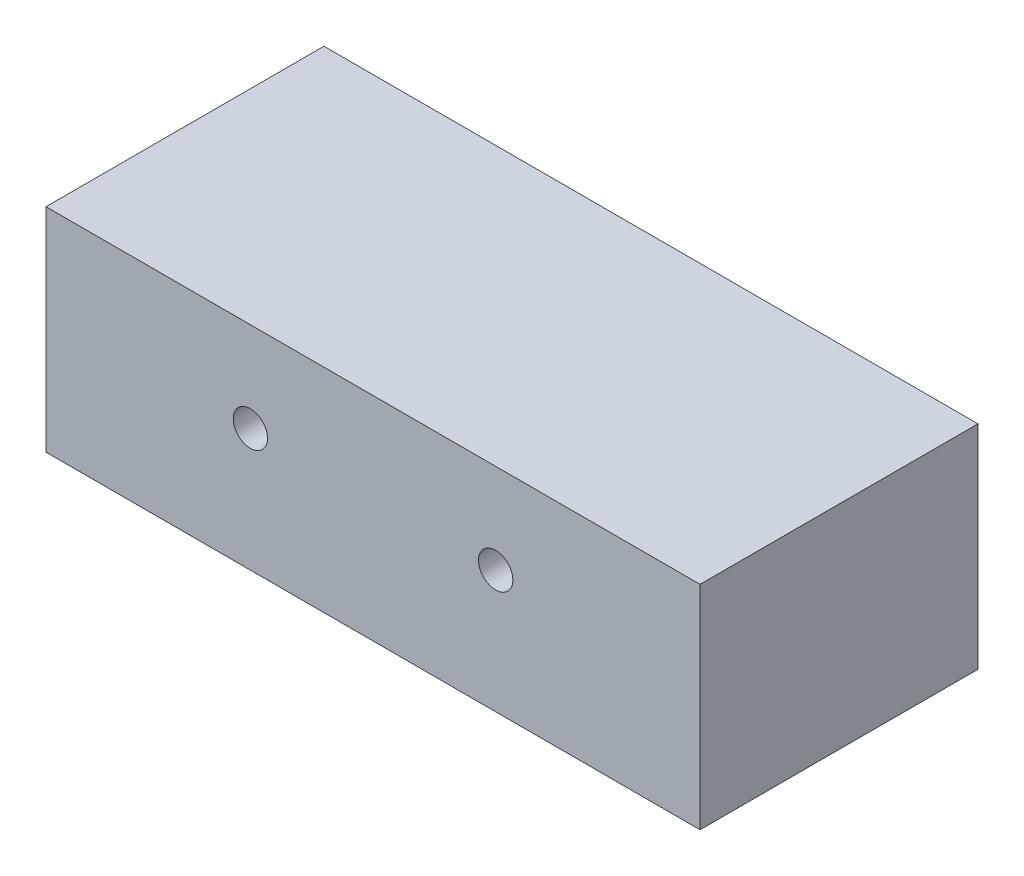
ISO-10303-21;
HEADER;
FILE_DESCRIPTION(('STEP AP214'),'2;1');
FILE_NAME('part.step','',(''),(''),'','','');
FILE_SCHEMA(('AUTOMOTIVE_DESIGN { 1 0 10303 214 1 1 1 1 }'));
ENDSEC;
DATA;
#1=APPLICATION_CONTEXT('core data for automotive mechanical design processes');
#2=APPLICATION_PROTOCOL_DEFINITION('international standard','automotive_design',2000,#1);
#3=PRODUCT_CONTEXT('',#1,'mechanical');
#4=PRODUCT('Part','Part','',(#3));
#5=PRODUCT_RELATED_PRODUCT_CATEGORY('part','',(#4));
#6=PRODUCT_DEFINITION_FORMATION('','',#4);
#7=PRODUCT_DEFINITION_CONTEXT('part definition',#1,'design');
#8=PRODUCT_DEFINITION('design','',#6,#7);
#9=PRODUCT_DEFINITION_SHAPE('','',#8);
#10=(LENGTH_UNIT() NAMED_UNIT(*) SI_UNIT(.MILLI.,.METRE.));
#11=(NAMED_UNIT(*) PLANE_ANGLE_UNIT() SI_UNIT($,.RADIAN.));
#12=(NAMED_UNIT(*) SI_UNIT($,.STERADIAN.) SOLID_ANGLE_UNIT());
#13=UNCERTAINTY_MEASURE_WITH_UNIT(LENGTH_MEASURE(1.E-05),#10,'distance_accuracy_value','');
#14=(GEOMETRIC_REPRESENTATION_CONTEXT(3) GLOBAL_UNCERTAINTY_ASSIGNED_CONTEXT((#13)) GLOBAL_UNIT_ASSIGNED_CONTEXT((#10,
#11,#12)) REPRESENTATION_CONTEXT('',''));
#15=CARTESIAN_POINT('',(0.,0.,0.));
#16=DIRECTION('',(0.,0.,1.));
#17=DIRECTION('',(1.,0.,0.));
#18=AXIS2_PLACEMENT_3D('',#15,#16,#17);
#19=CARTESIAN_POINT('',(0.,0.,34.));
#20=DIRECTION('',(1.,0.,0.));
#21=DIRECTION('',(0.,0.,-1.));
#22=AXIS2_PLACEMENT_3D('',#19,#20,#21);
#23=PLANE('',#22);
#24=DIRECTION('',(0.,-1.,0.));
#25=VECTOR('',#24,1.);
#26=CARTESIAN_POINT('',(0.,0.,0.));
#27=LINE('',#26,#25);
#28=CARTESIAN_POINT('',(0.,26.,0.));
#29=VERTEX_POINT('',#28);
#30=CARTESIAN_POINT('',(0.,0.,0.));
#31=VERTEX_POINT('',#30);
#32=EDGE_CURVE('E128',#29,#31,#27,.T.);
#33=ORIENTED_EDGE('',*,*,#32,.T.);
#34=DIRECTION('',(0.,0.,-1.));
#35=VECTOR('',#34,1.);
#36=CARTESIAN_POINT('',(0.,0.,34.));
#37=LINE('',#36,#35);
#38=CARTESIAN_POINT('',(0.,0.,34.));
#39=VERTEX_POINT('',#38);
#40=EDGE_CURVE('E11',#39,#31,#37,.T.);
#41=ORIENTED_EDGE('',*,*,#40,.F.);
#42=DIRECTION('',(0.,-1.,0.));
#43=VECTOR('',#42,1.);
#44=CARTESIAN_POINT('',(0.,0.,34.));
#45=LINE('',#44,#43);
#46=CARTESIAN_POINT('',(0.,26.,34.));
#47=VERTEX_POINT('',#46);
#48=EDGE_CURVE('E129',#47,#39,#45,.T.);
#49=ORIENTED_EDGE('',*,*,#48,.F.);
#50=DIRECTION('',(0.,0.,-1.));
#51=VECTOR('',#50,1.);
#52=CARTESIAN_POINT('',(0.,26.,34.));
#53=LINE('',#52,#51);
#54=EDGE_CURVE('E135',#47,#29,#53,.T.);
#55=ORIENTED_EDGE('',*,*,#54,.T.);
#56=EDGE_LOOP('',(#33,#41,#49,#55));
#57=FACE_BOUND('',#56,.T.);
#58=ADVANCED_FACE('F35',(#57),#23,.F.);
#59=CARTESIAN_POINT('',(0.,0.,34.));
#60=DIRECTION('',(0.,1.,0.));
#61=DIRECTION('',(0.,0.,1.));
#62=AXIS2_PLACEMENT_3D('',#59,#60,#61);
#63=PLANE('',#62);
#64=DIRECTION('',(1.,0.,0.));
#65=VECTOR('',#64,1.);
#66=CARTESIAN_POINT('',(0.,0.,0.));
#67=LINE('',#66,#65);
#68=CARTESIAN_POINT('',(80.,0.,0.));
#69=VERTEX_POINT('',#68);
#70=EDGE_CURVE('E138',#31,#69,#67,.T.);
#71=ORIENTED_EDGE('',*,*,#70,.T.);
#72=DIRECTION('',(0.,0.,-1.));
#73=VECTOR('',#72,1.);
#74=CARTESIAN_POINT('',(80.,0.,34.));
#75=LINE('',#74,#73);
#76=CARTESIAN_POINT('',(80.,0.,34.));
#77=VERTEX_POINT('',#76);
#78=EDGE_CURVE('E43',#77,#69,#75,.T.);
#79=ORIENTED_EDGE('',*,*,#78,.F.);
#80=DIRECTION('',(1.,0.,0.));
#81=VECTOR('',#80,1.);
#82=CARTESIAN_POINT('',(0.,0.,34.));
#83=LINE('',#82,#81);
#84=EDGE_CURVE('E82',#39,#77,#83,.T.);
#85=ORIENTED_EDGE('',*,*,#84,.F.);
#86=ORIENTED_EDGE('',*,*,#40,.T.);
#87=EDGE_LOOP('',(#71,#79,#85,#86));
#88=FACE_BOUND('',#87,.T.);
#89=ADVANCED_FACE('F162',(#88),#63,.F.);
#90=CARTESIAN_POINT('',(80.,0.,34.));
#91=DIRECTION('',(-1.,0.,0.));
#92=DIRECTION('',(0.,0.,1.));
#93=AXIS2_PLACEMENT_3D('',#90,#91,#92);
#94=PLANE('',#93);
#95=DIRECTION('',(0.,1.,0.));
#96=VECTOR('',#95,1.);
#97=CARTESIAN_POINT('',(80.,0.,0.));
#98=LINE('',#97,#96);
#99=CARTESIAN_POINT('',(80.,26.,0.));
#100=VERTEX_POINT('',#99);
#101=EDGE_CURVE('E69',#69,#100,#98,.T.);
#102=ORIENTED_EDGE('',*,*,#101,.T.);
#103=DIRECTION('',(0.,0.,-1.));
#104=VECTOR('',#103,1.);
#105=CARTESIAN_POINT('',(80.,26.,34.));
#106=LINE('',#105,#104);
#107=CARTESIAN_POINT('',(80.,26.,34.));
#108=VERTEX_POINT('',#107);
#109=EDGE_CURVE('E143',#108,#100,#106,.T.);
#110=ORIENTED_EDGE('',*,*,#109,.F.);
#111=DIRECTION('',(0.,1.,0.));
#112=VECTOR('',#111,1.);
#113=CARTESIAN_POINT('',(80.,0.,34.));
#114=LINE('',#113,#112);
#115=EDGE_CURVE('E132',#77,#108,#114,.T.);
#116=ORIENTED_EDGE('',*,*,#115,.F.);
#117=ORIENTED_EDGE('',*,*,#78,.T.);
#118=EDGE_LOOP('',(#102,#110,#116,#117));
#119=FACE_BOUND('',#118,.T.);
#120=ADVANCED_FACE('F145',(#119),#94,.F.);
#121=CARTESIAN_POINT('',(0.,26.,34.));
#122=DIRECTION('',(0.,-1.,0.));
#123=DIRECTION('',(0.,0.,-1.));
#124=AXIS2_PLACEMENT_3D('',#121,#122,#123);
#125=PLANE('',#124);
#126=DIRECTION('',(-1.,0.,0.));
#127=VECTOR('',#126,1.);
#128=CARTESIAN_POINT('',(0.,26.,0.));
#129=LINE('',#128,#127);
#130=EDGE_CURVE('E75',#100,#29,#129,.T.);
#131=ORIENTED_EDGE('',*,*,#130,.T.);
#132=ORIENTED_EDGE('',*,*,#54,.F.);
#133=DIRECTION('',(-1.,0.,0.));
#134=VECTOR('',#133,1.);
#135=CARTESIAN_POINT('',(0.,26.,34.));
#136=LINE('',#135,#134);
#137=EDGE_CURVE('E51',#108,#47,#136,.T.);
#138=ORIENTED_EDGE('',*,*,#137,.F.);
#139=ORIENTED_EDGE('',*,*,#109,.T.);
#140=EDGE_LOOP('',(#131,#132,#138,#139));
#141=FACE_BOUND('',#140,.T.);
#142=ADVANCED_FACE('F152',(#141),#125,.F.);
#143=CARTESIAN_POINT('',(0.,26.,34.));
#144=DIRECTION('',(0.,0.,-1.));
#145=DIRECTION('',(-1.,0.,0.));
#146=AXIS2_PLACEMENT_3D('',#143,#144,#145);
#147=PLANE('',#146);
#148=CARTESIAN_POINT('',(25.,15.,34.));
#149=DIRECTION('',(0.,0.,1.));
#150=DIRECTION('',(1.,0.,0.));
#151=AXIS2_PLACEMENT_3D('',#148,#149,#150);
#152=CIRCLE('',#151,2.09999999999999);
#153=CARTESIAN_POINT('',(27.1,15.,34.));
#154=VERTEX_POINT('',#153);
#155=EDGE_CURVE('E106',#154,#154,#152,.T.);
#156=ORIENTED_EDGE('',*,*,#155,.F.);
#157=EDGE_LOOP('',(#156));
#158=FACE_BOUND('',#157,.T.);
#159=CARTESIAN_POINT('',(55.,15.,34.));
#160=DIRECTION('',(0.,0.,1.));
#161=DIRECTION('',(1.,0.,0.));
#162=AXIS2_PLACEMENT_3D('',#159,#160,#161);
#163=CIRCLE('',#162,2.09999999999999);
#164=CARTESIAN_POINT('',(57.1,15.,34.));
#165=VERTEX_POINT('',#164);
#166=EDGE_CURVE('E105',#165,#165,#163,.T.);
#167=ORIENTED_EDGE('',*,*,#166,.F.);
#168=EDGE_LOOP('',(#167));
#169=FACE_BOUND('',#168,.T.);
#170=ORIENTED_EDGE('',*,*,#48,.T.);
#171=ORIENTED_EDGE('',*,*,#84,.T.);
#172=ORIENTED_EDGE('',*,*,#115,.T.);
#173=ORIENTED_EDGE('',*,*,#137,.T.);
#174=EDGE_LOOP('',(#170,#171,#172,#173));
#175=FACE_BOUND('',#174,.T.);
#176=ADVANCED_FACE('F154',(#158,#169,#175),#147,.F.);
#177=CARTESIAN_POINT('',(0.,26.,0.));
#178=DIRECTION('',(0.,0.,-1.));
#179=DIRECTION('',(-1.,0.,0.));
#180=AXIS2_PLACEMENT_3D('',#177,#178,#179);
#181=PLANE('',#180);
#182=CARTESIAN_POINT('',(55.,15.,0.));
#183=DIRECTION('',(0.,0.,-1.));
#184=DIRECTION('',(-1.,0.,0.));
#185=AXIS2_PLACEMENT_3D('',#182,#183,#184);
#186=CIRCLE('',#185,2.1);
#187=CARTESIAN_POINT('',(52.9,15.,0.));
#188=VERTEX_POINT('',#187);
#189=EDGE_CURVE('E116',#188,#188,#186,.T.);
#190=ORIENTED_EDGE('',*,*,#189,.F.);
#191=EDGE_LOOP('',(#190));
#192=FACE_BOUND('',#191,.T.);
#193=CARTESIAN_POINT('',(25.,15.,0.));
#194=DIRECTION('',(0.,0.,-1.));
#195=DIRECTION('',(-1.,0.,0.));
#196=AXIS2_PLACEMENT_3D('',#193,#194,#195);
#197=CIRCLE('',#196,2.1);
#198=CARTESIAN_POINT('',(22.9,15.,0.));
#199=VERTEX_POINT('',#198);
#200=EDGE_CURVE('E122',#199,#199,#197,.T.);
#201=ORIENTED_EDGE('',*,*,#200,.F.);
#202=EDGE_LOOP('',(#201));
#203=FACE_BOUND('',#202,.T.);
#204=ORIENTED_EDGE('',*,*,#32,.F.);
#205=ORIENTED_EDGE('',*,*,#130,.F.);
#206=ORIENTED_EDGE('',*,*,#101,.F.);
#207=ORIENTED_EDGE('',*,*,#70,.F.);
#208=EDGE_LOOP('',(#204,#205,#206,#207));
#209=FACE_BOUND('',#208,.T.);
#210=ADVANCED_FACE('F148',(#192,#203,#209),#181,.T.);
#211=CARTESIAN_POINT('',(25.,15.,12.4));
#212=DIRECTION('',(0.,0.,-1.));
#213=DIRECTION('',(-1.,0.,0.));
#214=AXIS2_PLACEMENT_3D('',#211,#212,#213);
#215=CONICAL_SURFACE('',#214,2.1,1.02974425867665);
#216=CARTESIAN_POINT('',(25.,15.,13.6618072999579));
#217=VERTEX_POINT('',#216);
#218=VERTEX_LOOP('',#217);
#219=FACE_BOUND('',#218,.T.);
#220=CARTESIAN_POINT('',(25.,15.,12.4));
#221=DIRECTION('',(0.,0.,-1.));
#222=DIRECTION('',(-1.,0.,0.));
#223=AXIS2_PLACEMENT_3D('',#220,#221,#222);
#224=CIRCLE('',#223,2.1);
#225=CARTESIAN_POINT('',(22.9,15.,12.4));
#226=VERTEX_POINT('',#225);
#227=EDGE_CURVE('E125',#226,#226,#224,.T.);
#228=ORIENTED_EDGE('',*,*,#227,.T.);
#229=EDGE_LOOP('',(#228));
#230=FACE_BOUND('',#229,.T.);
#231=ADVANCED_FACE('F189',(#219,#230),#215,.F.);
#232=CARTESIAN_POINT('',(25.,15.,0.));
#233=DIRECTION('',(0.,0.,-1.));
#234=DIRECTION('',(-1.,0.,0.));
#235=AXIS2_PLACEMENT_3D('',#232,#233,#234);
#236=CYLINDRICAL_SURFACE('',#235,2.1);
#237=ORIENTED_EDGE('',*,*,#227,.F.);
#238=EDGE_LOOP('',(#237));
#239=FACE_BOUND('',#238,.T.);
#240=ORIENTED_EDGE('',*,*,#200,.T.);
#241=EDGE_LOOP('',(#240));
#242=FACE_BOUND('',#241,.T.);
#243=ADVANCED_FACE('F198',(#239,#242),#236,.F.);
#244=CARTESIAN_POINT('',(55.,15.,12.4));
#245=DIRECTION('',(0.,0.,-1.));
#246=DIRECTION('',(-1.,0.,0.));
#247=AXIS2_PLACEMENT_3D('',#244,#245,#246);
#248=CONICAL_SURFACE('',#247,2.1,1.02974425867665);
#249=CARTESIAN_POINT('',(55.,15.,13.6618072999579));
#250=VERTEX_POINT('',#249);
#251=VERTEX_LOOP('',#250);
#252=FACE_BOUND('',#251,.T.);
#253=CARTESIAN_POINT('',(55.,15.,12.4));
#254=DIRECTION('',(0.,0.,-1.));
#255=DIRECTION('',(-1.,0.,0.));
#256=AXIS2_PLACEMENT_3D('',#253,#254,#255);
#257=CIRCLE('',#256,2.1);
#258=CARTESIAN_POINT('',(52.9,15.,12.4));
#259=VERTEX_POINT('',#258);
#260=EDGE_CURVE('E119',#259,#259,#257,.T.);
#261=ORIENTED_EDGE('',*,*,#260,.T.);
#262=EDGE_LOOP('',(#261));
#263=FACE_BOUND('',#262,.T.);
#264=ADVANCED_FACE('F209',(#252,#263),#248,.F.);
#265=CARTESIAN_POINT('',(55.,15.,0.));
#266=DIRECTION('',(0.,0.,-1.));
#267=DIRECTION('',(-1.,0.,0.));
#268=AXIS2_PLACEMENT_3D('',#265,#266,#267);
#269=CYLINDRICAL_SURFACE('',#268,2.1);
#270=ORIENTED_EDGE('',*,*,#260,.F.);
#271=EDGE_LOOP('',(#270));
#272=FACE_BOUND('',#271,.T.);
#273=ORIENTED_EDGE('',*,*,#189,.T.);
#274=EDGE_LOOP('',(#273));
#275=FACE_BOUND('',#274,.T.);
#276=ADVANCED_FACE('F220',(#272,#275),#269,.F.);
#277=CARTESIAN_POINT('',(55.,15.,21.6));
#278=DIRECTION('',(0.,0.,1.));
#279=DIRECTION('',(1.,0.,0.));
#280=AXIS2_PLACEMENT_3D('',#277,#278,#279);
#281=CONICAL_SURFACE('',#280,2.09999999999998,1.02974425867665);
#282=CARTESIAN_POINT('',(55.,15.,20.3381927000421));
#283=VERTEX_POINT('',#282);
#284=VERTEX_LOOP('',#283);
#285=FACE_BOUND('',#284,.T.);
#286=CARTESIAN_POINT('',(55.,15.,21.6));
#287=DIRECTION('',(0.,0.,1.));
#288=DIRECTION('',(1.,0.,0.));
#289=AXIS2_PLACEMENT_3D('',#286,#287,#288);
#290=CIRCLE('',#289,2.09999999999998);
#291=CARTESIAN_POINT('',(57.1,15.,21.6));
#292=VERTEX_POINT('',#291);
#293=EDGE_CURVE('E109',#292,#292,#290,.T.);
#294=ORIENTED_EDGE('',*,*,#293,.T.);
#295=EDGE_LOOP('',(#294));
#296=FACE_BOUND('',#295,.T.);
#297=ADVANCED_FACE('F230',(#285,#296),#281,.F.);
#298=CARTESIAN_POINT('',(55.,15.,34.));
#299=DIRECTION('',(0.,0.,1.));
#300=DIRECTION('',(1.,0.,0.));
#301=AXIS2_PLACEMENT_3D('',#298,#299,#300);
#302=CYLINDRICAL_SURFACE('',#301,2.09999999999999);
#303=ORIENTED_EDGE('',*,*,#293,.F.);
#304=EDGE_LOOP('',(#303));
#305=FACE_BOUND('',#304,.T.);
#306=ORIENTED_EDGE('',*,*,#166,.T.);
#307=EDGE_LOOP('',(#306));
#308=FACE_BOUND('',#307,.T.);
#309=ADVANCED_FACE('F99',(#305,#308),#302,.F.);
#310=CARTESIAN_POINT('',(25.,15.,21.6));
#311=DIRECTION('',(0.,0.,1.));
#312=DIRECTION('',(1.,0.,0.));
#313=AXIS2_PLACEMENT_3D('',#310,#311,#312);
#314=CONICAL_SURFACE('',#313,2.09999999999999,1.02974425867665);
#315=CARTESIAN_POINT('',(25.,15.,20.3381927000421));
#316=VERTEX_POINT('',#315);
#317=VERTEX_LOOP('',#316);
#318=FACE_BOUND('',#317,.T.);
#319=CARTESIAN_POINT('',(25.,15.,21.6));
#320=DIRECTION('',(0.,0.,1.));
#321=DIRECTION('',(1.,0.,0.));
#322=AXIS2_PLACEMENT_3D('',#319,#320,#321);
#323=CIRCLE('',#322,2.09999999999999);
#324=CARTESIAN_POINT('',(27.1,15.,21.6));
#325=VERTEX_POINT('',#324);
#326=EDGE_CURVE('E103',#325,#325,#323,.T.);
#327=ORIENTED_EDGE('',*,*,#326,.T.);
#328=EDGE_LOOP('',(#327));
#329=FACE_BOUND('',#328,.T.);
#330=ADVANCED_FACE('F95',(#318,#329),#314,.F.);
#331=CARTESIAN_POINT('',(25.,15.,34.));
#332=DIRECTION('',(0.,0.,1.));
#333=DIRECTION('',(1.,0.,0.));
#334=AXIS2_PLACEMENT_3D('',#331,#332,#333);
#335=CYLINDRICAL_SURFACE('',#334,2.09999999999999);
#336=ORIENTED_EDGE('',*,*,#326,.F.);
#337=EDGE_LOOP('',(#336));
#338=FACE_BOUND('',#337,.T.);
#339=ORIENTED_EDGE('',*,*,#155,.T.);
#340=EDGE_LOOP('',(#339));
#341=FACE_BOUND('',#340,.T.);
#342=ADVANCED_FACE('F98',(#338,#341),#335,.F.);
#343=CLOSED_SHELL('',(#58,#89,#120,#142,#176,#210,#231,#243,#264,#276,#297,#309,#330,#342));
#344=MANIFOLD_SOLID_BREP('B2',#343);
#345=ADVANCED_BREP_SHAPE_REPRESENTATION('',(#18,#344),#14);
#346=SHAPE_DEFINITION_REPRESENTATION(#9,#345);
ENDSEC;
END-ISO-10303-21;
